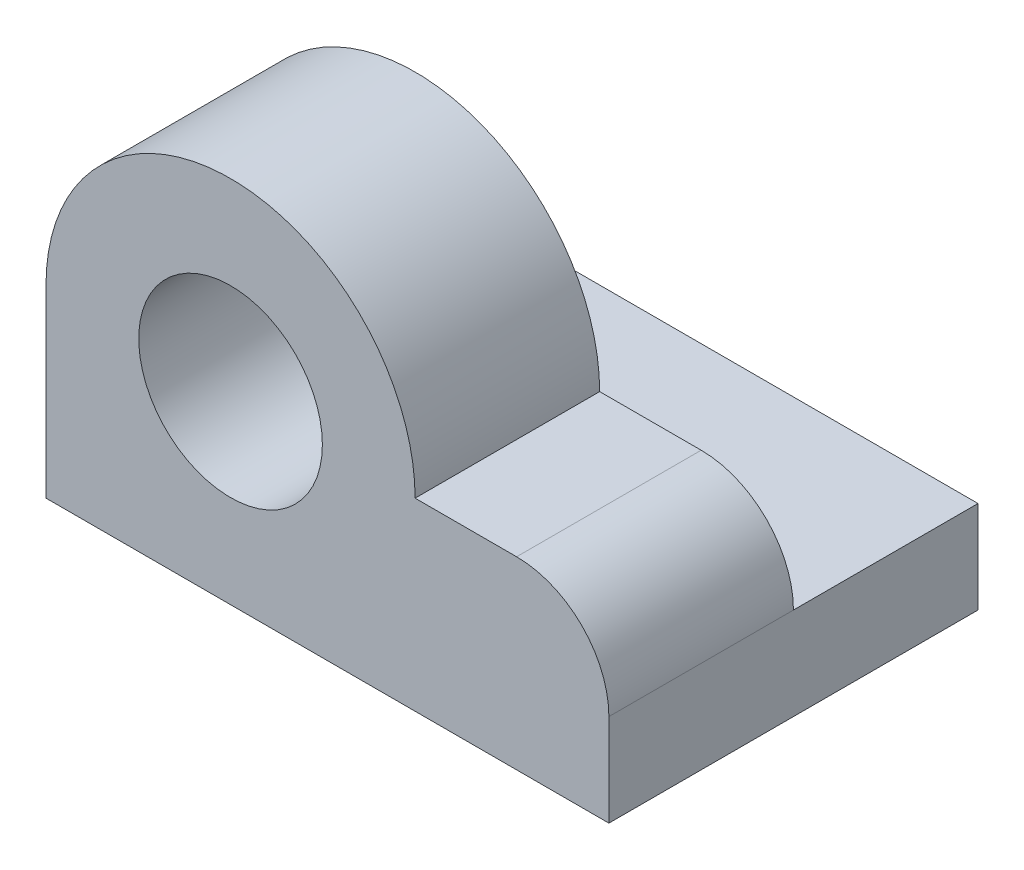
ISO-10303-21;
HEADER;
FILE_DESCRIPTION(('STEP AP214'),'2;1');
FILE_NAME('part.step','',(''),(''),'','','');
FILE_SCHEMA(('AUTOMOTIVE_DESIGN { 1 0 10303 214 1 1 1 1 }'));
ENDSEC;
DATA;
#1=APPLICATION_CONTEXT('core data for automotive mechanical design processes');
#2=APPLICATION_PROTOCOL_DEFINITION('international standard','automotive_design',2000,#1);
#3=PRODUCT_CONTEXT('',#1,'mechanical');
#4=PRODUCT('Part','Part','',(#3));
#5=PRODUCT_RELATED_PRODUCT_CATEGORY('part','',(#4));
#6=PRODUCT_DEFINITION_FORMATION('','',#4);
#7=PRODUCT_DEFINITION_CONTEXT('part definition',#1,'design');
#8=PRODUCT_DEFINITION('design','',#6,#7);
#9=PRODUCT_DEFINITION_SHAPE('','',#8);
#10=(LENGTH_UNIT() NAMED_UNIT(*) SI_UNIT(.MILLI.,.METRE.));
#11=(NAMED_UNIT(*) PLANE_ANGLE_UNIT() SI_UNIT($,.RADIAN.));
#12=(NAMED_UNIT(*) SI_UNIT($,.STERADIAN.) SOLID_ANGLE_UNIT());
#13=UNCERTAINTY_MEASURE_WITH_UNIT(LENGTH_MEASURE(1.E-05),#10,'distance_accuracy_value','');
#14=(GEOMETRIC_REPRESENTATION_CONTEXT(3) GLOBAL_UNCERTAINTY_ASSIGNED_CONTEXT((#13)) GLOBAL_UNIT_ASSIGNED_CONTEXT((#10,
#11,#12)) REPRESENTATION_CONTEXT('',''));
#15=CARTESIAN_POINT('',(0.,0.,0.));
#16=DIRECTION('',(0.,0.,1.));
#17=DIRECTION('',(1.,0.,0.));
#18=AXIS2_PLACEMENT_3D('',#15,#16,#17);
#19=CARTESIAN_POINT('',(1549.4,254.,-1016.));
#20=DIRECTION('',(0.,-1.,0.));
#21=DIRECTION('',(0.,0.,-1.));
#22=AXIS2_PLACEMENT_3D('',#19,#20,#21);
#23=PLANE('',#22);
#24=DIRECTION('',(-1.,0.,0.));
#25=VECTOR('',#24,1.);
#26=CARTESIAN_POINT('',(0.,254.,-508.));
#27=LINE('',#26,#25);
#28=CARTESIAN_POINT('',(1549.4,254.,-508.));
#29=VERTEX_POINT('',#28);
#30=CARTESIAN_POINT('',(0.,254.,-508.));
#31=VERTEX_POINT('',#30);
#32=EDGE_CURVE('E59',#29,#31,#27,.T.);
#33=ORIENTED_EDGE('',*,*,#32,.F.);
#34=DIRECTION('',(0.,0.,1.));
#35=VECTOR('',#34,1.);
#36=CARTESIAN_POINT('',(1549.4,254.,-1016.));
#37=LINE('',#36,#35);
#38=CARTESIAN_POINT('',(1549.4,254.,-1016.));
#39=VERTEX_POINT('',#38);
#40=EDGE_CURVE('E183',#39,#29,#37,.T.);
#41=ORIENTED_EDGE('',*,*,#40,.F.);
#42=DIRECTION('',(-1.,0.,0.));
#43=VECTOR('',#42,1.);
#44=CARTESIAN_POINT('',(1549.4,254.,-1016.));
#45=LINE('',#44,#43);
#46=CARTESIAN_POINT('',(0.,254.,-1016.));
#47=VERTEX_POINT('',#46);
#48=EDGE_CURVE('E186',#39,#47,#45,.T.);
#49=ORIENTED_EDGE('',*,*,#48,.T.);
#50=DIRECTION('',(0.,0.,1.));
#51=VECTOR('',#50,1.);
#52=CARTESIAN_POINT('',(0.,254.,-1016.));
#53=LINE('',#52,#51);
#54=EDGE_CURVE('E177',#47,#31,#53,.T.);
#55=ORIENTED_EDGE('',*,*,#54,.T.);
#56=EDGE_LOOP('',(#33,#41,#49,#55));
#57=FACE_BOUND('',#56,.T.);
#58=ADVANCED_FACE('F43',(#57),#23,.F.);
#59=CARTESIAN_POINT('',(1549.4,254.,0.));
#60=DIRECTION('',(0.,0.,-1.));
#61=DIRECTION('',(-1.,0.,0.));
#62=AXIS2_PLACEMENT_3D('',#59,#60,#61);
#63=PLANE('',#62);
#64=DIRECTION('',(0.,-1.,0.));
#65=VECTOR('',#64,1.);
#66=CARTESIAN_POINT('',(0.,254.,0.));
#67=LINE('',#66,#65);
#68=CARTESIAN_POINT('',(0.,508.,0.));
#69=VERTEX_POINT('',#68);
#70=CARTESIAN_POINT('',(0.,0.,0.));
#71=VERTEX_POINT('',#70);
#72=EDGE_CURVE('E169',#69,#71,#67,.T.);
#73=ORIENTED_EDGE('',*,*,#72,.T.);
#74=DIRECTION('',(-1.,0.,0.));
#75=VECTOR('',#74,1.);
#76=CARTESIAN_POINT('',(1549.4,0.,0.));
#77=LINE('',#76,#75);
#78=CARTESIAN_POINT('',(1549.4,0.,0.));
#79=VERTEX_POINT('',#78);
#80=EDGE_CURVE('E11',#79,#71,#77,.T.);
#81=ORIENTED_EDGE('',*,*,#80,.F.);
#82=DIRECTION('',(0.,-1.,0.));
#83=VECTOR('',#82,1.);
#84=CARTESIAN_POINT('',(1549.4,254.,0.));
#85=LINE('',#84,#83);
#86=CARTESIAN_POINT('',(1549.4,254.,0.));
#87=VERTEX_POINT('',#86);
#88=EDGE_CURVE('E174',#87,#79,#85,.T.);
#89=ORIENTED_EDGE('',*,*,#88,.F.);
#90=CARTESIAN_POINT('',(1295.4,254.,0.));
#91=DIRECTION('',(0.,0.,1.));
#92=DIRECTION('',(1.,0.,0.));
#93=AXIS2_PLACEMENT_3D('',#90,#91,#92);
#94=CIRCLE('',#93,254.);
#95=CARTESIAN_POINT('',(1295.4,508.,0.));
#96=VERTEX_POINT('',#95);
#97=EDGE_CURVE('E156',#87,#96,#94,.T.);
#98=ORIENTED_EDGE('',*,*,#97,.T.);
#99=DIRECTION('',(1.,0.,0.));
#100=VECTOR('',#99,1.);
#101=CARTESIAN_POINT('',(0.,508.,0.));
#102=LINE('',#101,#100);
#103=CARTESIAN_POINT('',(1016.,508.,0.));
#104=VERTEX_POINT('',#103);
#105=EDGE_CURVE('E132',#104,#96,#102,.T.);
#106=ORIENTED_EDGE('',*,*,#105,.F.);
#107=CARTESIAN_POINT('',(508.,508.,0.));
#108=DIRECTION('',(0.,0.,1.));
#109=DIRECTION('',(1.,0.,0.));
#110=AXIS2_PLACEMENT_3D('',#107,#108,#109);
#111=CIRCLE('',#110,508.);
#112=EDGE_CURVE('E161',#104,#69,#111,.T.);
#113=ORIENTED_EDGE('',*,*,#112,.T.);
#114=EDGE_LOOP('',(#73,#81,#89,#98,#106,#113));
#115=FACE_BOUND('',#114,.T.);
#116=CARTESIAN_POINT('',(508.,508.,0.));
#117=DIRECTION('',(0.,0.,1.));
#118=DIRECTION('',(1.,0.,0.));
#119=AXIS2_PLACEMENT_3D('',#116,#117,#118);
#120=CIRCLE('',#119,252.73);
#121=CARTESIAN_POINT('',(760.73,508.,0.));
#122=VERTEX_POINT('',#121);
#123=EDGE_CURVE('E152',#122,#122,#120,.T.);
#124=ORIENTED_EDGE('',*,*,#123,.F.);
#125=EDGE_LOOP('',(#124));
#126=FACE_BOUND('',#125,.T.);
#127=ADVANCED_FACE('F45',(#115,#126),#63,.F.);
#128=CARTESIAN_POINT('',(1549.4,0.,0.));
#129=DIRECTION('',(0.,1.,0.));
#130=DIRECTION('',(0.,0.,1.));
#131=AXIS2_PLACEMENT_3D('',#128,#129,#130);
#132=PLANE('',#131);
#133=DIRECTION('',(0.,0.,-1.));
#134=VECTOR('',#133,1.);
#135=CARTESIAN_POINT('',(0.,0.,0.));
#136=LINE('',#135,#134);
#137=CARTESIAN_POINT('',(0.,0.,-1016.));
#138=VERTEX_POINT('',#137);
#139=EDGE_CURVE('E190',#71,#138,#136,.T.);
#140=ORIENTED_EDGE('',*,*,#139,.T.);
#141=DIRECTION('',(-1.,0.,0.));
#142=VECTOR('',#141,1.);
#143=CARTESIAN_POINT('',(1549.4,0.,-1016.));
#144=LINE('',#143,#142);
#145=CARTESIAN_POINT('',(1549.4,0.,-1016.));
#146=VERTEX_POINT('',#145);
#147=EDGE_CURVE('E52',#146,#138,#144,.T.);
#148=ORIENTED_EDGE('',*,*,#147,.F.);
#149=DIRECTION('',(0.,0.,-1.));
#150=VECTOR('',#149,1.);
#151=CARTESIAN_POINT('',(1549.4,0.,0.));
#152=LINE('',#151,#150);
#153=EDGE_CURVE('E94',#79,#146,#152,.T.);
#154=ORIENTED_EDGE('',*,*,#153,.F.);
#155=ORIENTED_EDGE('',*,*,#80,.T.);
#156=EDGE_LOOP('',(#140,#148,#154,#155));
#157=FACE_BOUND('',#156,.T.);
#158=ADVANCED_FACE('F210',(#157),#132,.F.);
#159=CARTESIAN_POINT('',(1549.4,0.,-1016.));
#160=DIRECTION('',(0.,0.,1.));
#161=DIRECTION('',(1.,0.,0.));
#162=AXIS2_PLACEMENT_3D('',#159,#160,#161);
#163=PLANE('',#162);
#164=DIRECTION('',(0.,1.,0.));
#165=VECTOR('',#164,1.);
#166=CARTESIAN_POINT('',(0.,0.,-1016.));
#167=LINE('',#166,#165);
#168=EDGE_CURVE('E87',#138,#47,#167,.T.);
#169=ORIENTED_EDGE('',*,*,#168,.T.);
#170=ORIENTED_EDGE('',*,*,#48,.F.);
#171=DIRECTION('',(0.,1.,0.));
#172=VECTOR('',#171,1.);
#173=CARTESIAN_POINT('',(1549.4,0.,-1016.));
#174=LINE('',#173,#172);
#175=EDGE_CURVE('E180',#146,#39,#174,.T.);
#176=ORIENTED_EDGE('',*,*,#175,.F.);
#177=ORIENTED_EDGE('',*,*,#147,.T.);
#178=EDGE_LOOP('',(#169,#170,#176,#177));
#179=FACE_BOUND('',#178,.T.);
#180=ADVANCED_FACE('F200',(#179),#163,.F.);
#181=CARTESIAN_POINT('',(1549.4,0.,0.));
#182=DIRECTION('',(1.,0.,0.));
#183=DIRECTION('',(0.,0.,-1.));
#184=AXIS2_PLACEMENT_3D('',#181,#182,#183);
#185=PLANE('',#184);
#186=ORIENTED_EDGE('',*,*,#88,.T.);
#187=ORIENTED_EDGE('',*,*,#153,.T.);
#188=ORIENTED_EDGE('',*,*,#175,.T.);
#189=ORIENTED_EDGE('',*,*,#40,.T.);
#190=DIRECTION('',(0.,0.,1.));
#191=VECTOR('',#190,1.);
#192=CARTESIAN_POINT('',(1549.4,254.,-508.));
#193=LINE('',#192,#191);
#194=EDGE_CURVE('E67',#29,#87,#193,.T.);
#195=ORIENTED_EDGE('',*,*,#194,.T.);
#196=EDGE_LOOP('',(#186,#187,#188,#189,#195));
#197=FACE_BOUND('',#196,.T.);
#198=ADVANCED_FACE('F206',(#197),#185,.T.);
#199=CARTESIAN_POINT('',(0.,0.,0.));
#200=DIRECTION('',(1.,0.,0.));
#201=DIRECTION('',(0.,0.,-1.));
#202=AXIS2_PLACEMENT_3D('',#199,#200,#201);
#203=PLANE('',#202);
#204=ORIENTED_EDGE('',*,*,#72,.F.);
#205=DIRECTION('',(0.,0.,1.));
#206=VECTOR('',#205,1.);
#207=CARTESIAN_POINT('',(0.,508.,-508.));
#208=LINE('',#207,#206);
#209=CARTESIAN_POINT('',(0.,508.,-508.));
#210=VERTEX_POINT('',#209);
#211=EDGE_CURVE('E165',#210,#69,#208,.T.);
#212=ORIENTED_EDGE('',*,*,#211,.F.);
#213=DIRECTION('',(0.,1.,0.));
#214=VECTOR('',#213,1.);
#215=CARTESIAN_POINT('',(0.,0.,-508.));
#216=LINE('',#215,#214);
#217=EDGE_CURVE('E149',#31,#210,#216,.T.);
#218=ORIENTED_EDGE('',*,*,#217,.F.);
#219=ORIENTED_EDGE('',*,*,#54,.F.);
#220=ORIENTED_EDGE('',*,*,#168,.F.);
#221=ORIENTED_EDGE('',*,*,#139,.F.);
#222=EDGE_LOOP('',(#204,#212,#218,#219,#220,#221));
#223=FACE_BOUND('',#222,.T.);
#224=ADVANCED_FACE('F203',(#223),#203,.F.);
#225=CARTESIAN_POINT('',(508.,508.,-508.));
#226=DIRECTION('',(0.,0.,1.));
#227=DIRECTION('',(1.,0.,0.));
#228=AXIS2_PLACEMENT_3D('',#225,#226,#227);
#229=CYLINDRICAL_SURFACE('',#228,508.);
#230=ORIENTED_EDGE('',*,*,#112,.F.);
#231=DIRECTION('',(0.,0.,1.));
#232=VECTOR('',#231,1.);
#233=CARTESIAN_POINT('',(1016.,508.,-508.));
#234=LINE('',#233,#232);
#235=CARTESIAN_POINT('',(1016.,508.,-508.));
#236=VERTEX_POINT('',#235);
#237=EDGE_CURVE('E137',#236,#104,#234,.T.);
#238=ORIENTED_EDGE('',*,*,#237,.F.);
#239=CARTESIAN_POINT('',(508.,508.,-508.));
#240=DIRECTION('',(0.,0.,1.));
#241=DIRECTION('',(1.,0.,0.));
#242=AXIS2_PLACEMENT_3D('',#239,#240,#241);
#243=CIRCLE('',#242,508.);
#244=EDGE_CURVE('E124',#236,#210,#243,.T.);
#245=ORIENTED_EDGE('',*,*,#244,.T.);
#246=ORIENTED_EDGE('',*,*,#211,.T.);
#247=EDGE_LOOP('',(#230,#238,#245,#246));
#248=FACE_BOUND('',#247,.T.);
#249=ADVANCED_FACE('F224',(#248),#229,.T.);
#250=CARTESIAN_POINT('',(0.,508.,-508.));
#251=DIRECTION('',(0.,-1.,0.));
#252=DIRECTION('',(0.,0.,-1.));
#253=AXIS2_PLACEMENT_3D('',#250,#251,#252);
#254=PLANE('',#253);
#255=ORIENTED_EDGE('',*,*,#105,.T.);
#256=DIRECTION('',(0.,0.,1.));
#257=VECTOR('',#256,1.);
#258=CARTESIAN_POINT('',(1295.4,508.,-508.));
#259=LINE('',#258,#257);
#260=CARTESIAN_POINT('',(1295.4,508.,-508.));
#261=VERTEX_POINT('',#260);
#262=EDGE_CURVE('E129',#261,#96,#259,.T.);
#263=ORIENTED_EDGE('',*,*,#262,.F.);
#264=DIRECTION('',(1.,0.,0.));
#265=VECTOR('',#264,1.);
#266=CARTESIAN_POINT('',(0.,508.,-508.));
#267=LINE('',#266,#265);
#268=EDGE_CURVE('E118',#236,#261,#267,.T.);
#269=ORIENTED_EDGE('',*,*,#268,.F.);
#270=ORIENTED_EDGE('',*,*,#237,.T.);
#271=EDGE_LOOP('',(#255,#263,#269,#270));
#272=FACE_BOUND('',#271,.T.);
#273=ADVANCED_FACE('F130',(#272),#254,.F.);
#274=CARTESIAN_POINT('',(508.,508.,-508.));
#275=DIRECTION('',(0.,0.,1.));
#276=DIRECTION('',(1.,0.,0.));
#277=AXIS2_PLACEMENT_3D('',#274,#275,#276);
#278=CYLINDRICAL_SURFACE('',#277,252.73);
#279=CARTESIAN_POINT('',(508.,508.,-508.));
#280=DIRECTION('',(0.,0.,1.));
#281=DIRECTION('',(1.,0.,0.));
#282=AXIS2_PLACEMENT_3D('',#279,#280,#281);
#283=CIRCLE('',#282,252.73);
#284=CARTESIAN_POINT('',(760.73,508.,-508.));
#285=VERTEX_POINT('',#284);
#286=EDGE_CURVE('E143',#285,#285,#283,.T.);
#287=ORIENTED_EDGE('',*,*,#286,.F.);
#288=EDGE_LOOP('',(#287));
#289=FACE_BOUND('',#288,.T.);
#290=ORIENTED_EDGE('',*,*,#123,.T.);
#291=EDGE_LOOP('',(#290));
#292=FACE_BOUND('',#291,.T.);
#293=ADVANCED_FACE('F227',(#289,#292),#278,.F.);
#294=CARTESIAN_POINT('',(1295.4,254.,-508.));
#295=DIRECTION('',(0.,0.,1.));
#296=DIRECTION('',(1.,0.,0.));
#297=AXIS2_PLACEMENT_3D('',#294,#295,#296);
#298=CYLINDRICAL_SURFACE('',#297,254.);
#299=ORIENTED_EDGE('',*,*,#97,.F.);
#300=ORIENTED_EDGE('',*,*,#194,.F.);
#301=CARTESIAN_POINT('',(1295.4,254.,-508.));
#302=DIRECTION('',(0.,0.,1.));
#303=DIRECTION('',(1.,0.,0.));
#304=AXIS2_PLACEMENT_3D('',#301,#302,#303);
#305=CIRCLE('',#304,254.);
#306=EDGE_CURVE('E122',#29,#261,#305,.T.);
#307=ORIENTED_EDGE('',*,*,#306,.T.);
#308=ORIENTED_EDGE('',*,*,#262,.T.);
#309=EDGE_LOOP('',(#299,#300,#307,#308));
#310=FACE_BOUND('',#309,.T.);
#311=ADVANCED_FACE('F139',(#310),#298,.T.);
#312=CARTESIAN_POINT('',(0.,0.,-508.));
#313=DIRECTION('',(0.,0.,1.));
#314=DIRECTION('',(1.,0.,0.));
#315=AXIS2_PLACEMENT_3D('',#312,#313,#314);
#316=PLANE('',#315);
#317=ORIENTED_EDGE('',*,*,#286,.T.);
#318=EDGE_LOOP('',(#317));
#319=FACE_BOUND('',#318,.T.);
#320=ORIENTED_EDGE('',*,*,#32,.T.);
#321=ORIENTED_EDGE('',*,*,#217,.T.);
#322=ORIENTED_EDGE('',*,*,#244,.F.);
#323=ORIENTED_EDGE('',*,*,#268,.T.);
#324=ORIENTED_EDGE('',*,*,#306,.F.);
#325=EDGE_LOOP('',(#320,#321,#322,#323,#324));
#326=FACE_BOUND('',#325,.T.);
#327=ADVANCED_FACE('F120',(#319,#326),#316,.F.);
#328=CLOSED_SHELL('',(#58,#127,#158,#180,#198,#224,#249,#273,#293,#311,#327));
#329=MANIFOLD_SOLID_BREP('B2',#328);
#330=ADVANCED_BREP_SHAPE_REPRESENTATION('',(#18,#329),#14);
#331=SHAPE_DEFINITION_REPRESENTATION(#9,#330);
ENDSEC;
END-ISO-10303-21;
